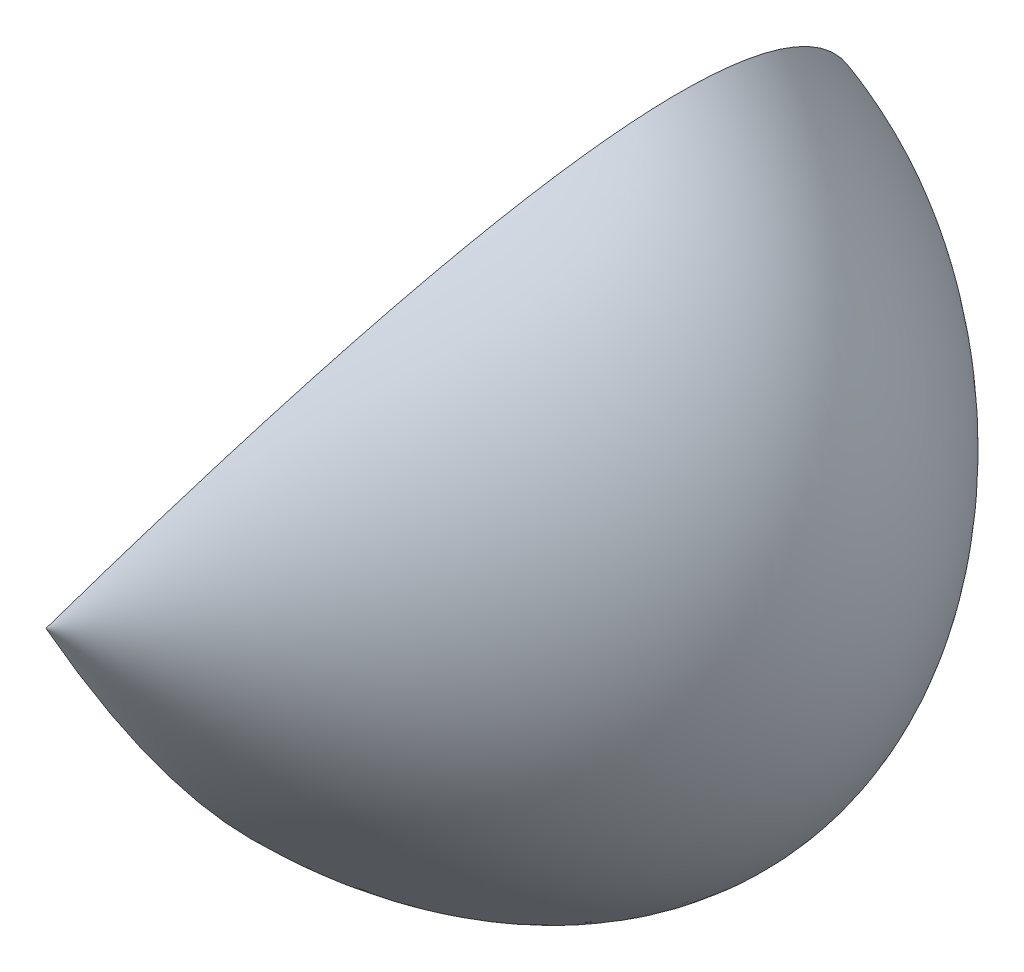
ISO-10303-21;
HEADER;
FILE_DESCRIPTION(('STEP AP214'),'2;1');
FILE_NAME('part.step','',(''),(''),'','','');
FILE_SCHEMA(('AUTOMOTIVE_DESIGN { 1 0 10303 214 1 1 1 1 }'));
ENDSEC;
DATA;
#1=APPLICATION_CONTEXT('core data for automotive mechanical design processes');
#2=APPLICATION_PROTOCOL_DEFINITION('international standard','automotive_design',2000,#1);
#3=PRODUCT_CONTEXT('',#1,'mechanical');
#4=PRODUCT('Part','Part','',(#3));
#5=PRODUCT_RELATED_PRODUCT_CATEGORY('part','',(#4));
#6=PRODUCT_DEFINITION_FORMATION('','',#4);
#7=PRODUCT_DEFINITION_CONTEXT('part definition',#1,'design');
#8=PRODUCT_DEFINITION('design','',#6,#7);
#9=PRODUCT_DEFINITION_SHAPE('','',#8);
#10=(LENGTH_UNIT() NAMED_UNIT(*) SI_UNIT(.MILLI.,.METRE.));
#11=(NAMED_UNIT(*) PLANE_ANGLE_UNIT() SI_UNIT($,.RADIAN.));
#12=(NAMED_UNIT(*) SI_UNIT($,.STERADIAN.) SOLID_ANGLE_UNIT());
#13=UNCERTAINTY_MEASURE_WITH_UNIT(LENGTH_MEASURE(1.E-05),#10,'distance_accuracy_value','');
#14=(GEOMETRIC_REPRESENTATION_CONTEXT(3) GLOBAL_UNCERTAINTY_ASSIGNED_CONTEXT((#13)) GLOBAL_UNIT_ASSIGNED_CONTEXT((#10,
#11,#12)) REPRESENTATION_CONTEXT('',''));
#15=CARTESIAN_POINT('',(0.,0.,0.));
#16=DIRECTION('',(0.,0.,1.));
#17=DIRECTION('',(1.,0.,0.));
#18=AXIS2_PLACEMENT_3D('',#15,#16,#17);
#19=CARTESIAN_POINT('',(0.,0.,86.5516719788309));
#20=CARTESIAN_POINT('',(86.2785726922062,149.438871507427,-11.56866296833));
#21=CARTESIAN_POINT('',(0.,0.,-88.188583032804));
#22=B_SPLINE_CURVE_WITH_KNOTS('',2,(#19,#20,#21),.UNSPECIFIED.,.F.,.F.,(3,3),(0.,1.),.UNSPECIFIED.);
#23=CARTESIAN_POINT('',(0.,0.,-88.1885830328041));
#24=DIRECTION('',(0.,0.,-1.));
#25=AXIS1_PLACEMENT('',#23,#24);
#26=SURFACE_OF_REVOLUTION('',#22,#25);
#27=CARTESIAN_POINT('',(0.,0.,86.5516719788309));
#28=CARTESIAN_POINT('',(-6.0248005299372E-13,-172.557145384413,-11.56866296833));
#29=CARTESIAN_POINT('',(0.,0.,-88.1885830328041));
#30=B_SPLINE_CURVE_WITH_KNOTS('',2,(#27,#28,#29),.UNSPECIFIED.,.F.,.F.,(3,3),(0.,1.),.UNSPECIFIED.);
#31=CARTESIAN_POINT('',(0.,0.,86.5516719788309));
#32=VERTEX_POINT('',#31);
#33=CARTESIAN_POINT('',(0.,0.,-88.188583032804));
#34=VERTEX_POINT('',#33);
#35=EDGE_CURVE('E46',#32,#34,#30,.T.);
#36=ORIENTED_EDGE('',*,*,#35,.T.);
#37=EDGE_CURVE('E40',#32,#34,#22,.T.);
#38=ORIENTED_EDGE('',*,*,#37,.F.);
#39=EDGE_LOOP('',(#36,#38));
#40=FACE_BOUND('',#39,.T.);
#41=ADVANCED_FACE('F33',(#40),#26,.T.);
#42=CARTESIAN_POINT('',(43.1392863461031,74.7194357537133,-6.19355924765827));
#43=DIRECTION('',(-0.86602540378444,0.499999999999998,0.));
#44=DIRECTION('',(0.,0.,1.));
#45=AXIS2_PLACEMENT_3D('',#42,#43,#44);
#46=PLANE('',#45);
#47=ORIENTED_EDGE('',*,*,#37,.T.);
#48=DIRECTION('',(0.,0.,1.));
#49=VECTOR('',#48,1.);
#50=CARTESIAN_POINT('',(0.,0.,-88.188583032804));
#51=LINE('',#50,#49);
#52=EDGE_CURVE('E11',#34,#32,#51,.T.);
#53=ORIENTED_EDGE('',*,*,#52,.T.);
#54=EDGE_LOOP('',(#47,#53));
#55=FACE_BOUND('',#54,.T.);
#56=ADVANCED_FACE('F53',(#55),#46,.T.);
#57=CARTESIAN_POINT('',(-3.0124002649686E-13,-86.2785726922066,-6.19355924765827));
#58=DIRECTION('',(1.,0.,0.));
#59=DIRECTION('',(0.,0.,1.));
#60=AXIS2_PLACEMENT_3D('',#57,#58,#59);
#61=PLANE('',#60);
#62=ORIENTED_EDGE('',*,*,#35,.F.);
#63=ORIENTED_EDGE('',*,*,#52,.F.);
#64=EDGE_LOOP('',(#62,#63));
#65=FACE_BOUND('',#64,.T.);
#66=ADVANCED_FACE('F48',(#65),#61,.F.);
#67=CLOSED_SHELL('',(#41,#56,#66));
#68=MANIFOLD_SOLID_BREP('B2',#67);
#69=ADVANCED_BREP_SHAPE_REPRESENTATION('',(#18,#68),#14);
#70=SHAPE_DEFINITION_REPRESENTATION(#9,#69);
ENDSEC;
END-ISO-10303-21;
